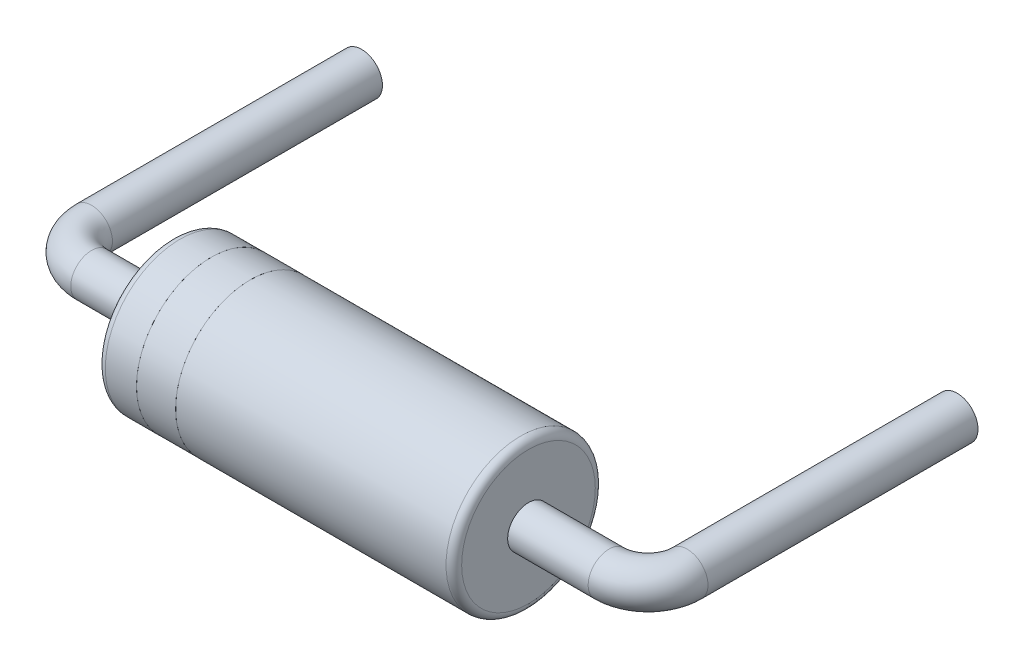
ISO-10303-21;
HEADER;
FILE_DESCRIPTION(('STEP AP214'),'2;1');
FILE_NAME('part.step','',(''),(''),'','','');
FILE_SCHEMA(('AUTOMOTIVE_DESIGN { 1 0 10303 214 1 1 1 1 }'));
ENDSEC;
DATA;
#1=APPLICATION_CONTEXT('core data for automotive mechanical design processes');
#2=APPLICATION_PROTOCOL_DEFINITION('international standard','automotive_design',2000,#1);
#3=PRODUCT_CONTEXT('',#1,'mechanical');
#4=PRODUCT('Part','Part','',(#3));
#5=PRODUCT_RELATED_PRODUCT_CATEGORY('part','',(#4));
#6=PRODUCT_DEFINITION_FORMATION('','',#4);
#7=PRODUCT_DEFINITION_CONTEXT('part definition',#1,'design');
#8=PRODUCT_DEFINITION('design','',#6,#7);
#9=PRODUCT_DEFINITION_SHAPE('','',#8);
#10=(LENGTH_UNIT() NAMED_UNIT(*) SI_UNIT(.MILLI.,.METRE.));
#11=(NAMED_UNIT(*) PLANE_ANGLE_UNIT() SI_UNIT($,.RADIAN.));
#12=(NAMED_UNIT(*) SI_UNIT($,.STERADIAN.) SOLID_ANGLE_UNIT());
#13=UNCERTAINTY_MEASURE_WITH_UNIT(LENGTH_MEASURE(1.E-05),#10,'distance_accuracy_value','');
#14=(GEOMETRIC_REPRESENTATION_CONTEXT(3) GLOBAL_UNCERTAINTY_ASSIGNED_CONTEXT((#13)) GLOBAL_UNIT_ASSIGNED_CONTEXT((#10,
#11,#12)) REPRESENTATION_CONTEXT('',''));
#15=CARTESIAN_POINT('',(0.,0.,0.));
#16=DIRECTION('',(0.,0.,1.));
#17=DIRECTION('',(1.,0.,0.));
#18=AXIS2_PLACEMENT_3D('',#15,#16,#17);
#19=CARTESIAN_POINT('',(-2.28,-0.29315,1.24815));
#20=DIRECTION('',(1.,0.,0.));
#21=DIRECTION('',(0.,0.,-1.));
#22=AXIS2_PLACEMENT_3D('',#19,#20,#21);
#23=PLANE('',#22);
#24=CARTESIAN_POINT('',(-2.28,0.,0.955));
#25=DIRECTION('',(1.,0.,0.));
#26=DIRECTION('',(0.,0.,-1.));
#27=AXIS2_PLACEMENT_3D('',#24,#25,#26);
#28=CIRCLE('',#27,0.2665);
#29=CARTESIAN_POINT('',(-2.28,0.,0.6885));
#30=VERTEX_POINT('',#29);
#31=EDGE_CURVE('P0_E25',#30,#30,#28,.F.);
#32=ORIENTED_EDGE('',*,*,#31,.F.);
#33=EDGE_LOOP('',(#32));
#34=FACE_BOUND('',#33,.T.);
#35=ADVANCED_FACE('P0_F22',(#34),#23,.T.);
#36=CARTESIAN_POINT('',(-3.3615,0.,0.955));
#37=DIRECTION('',(1.,0.,0.));
#38=DIRECTION('',(0.,0.,-1.));
#39=AXIS2_PLACEMENT_3D('',#36,#37,#38);
#40=CYLINDRICAL_SURFACE('',#39,0.2665);
#41=ORIENTED_EDGE('',*,*,#31,.T.);
#42=EDGE_LOOP('',(#41));
#43=FACE_BOUND('',#42,.T.);
#44=CARTESIAN_POINT('',(-3.31,0.,0.955));
#45=DIRECTION('',(1.,0.,0.));
#46=DIRECTION('',(0.,0.,1.));
#47=AXIS2_PLACEMENT_3D('',#44,#45,#46);
#48=CIRCLE('',#47,0.2665);
#49=CARTESIAN_POINT('',(-3.31,0.,1.2215));
#50=VERTEX_POINT('',#49);
#51=EDGE_CURVE('P0_E33',#50,#50,#48,.F.);
#52=ORIENTED_EDGE('',*,*,#51,.F.);
#53=EDGE_LOOP('',(#52));
#54=FACE_BOUND('',#53,.T.);
#55=ADVANCED_FACE('P0_F44',(#43,#54),#40,.T.);
#56=CARTESIAN_POINT('',(-3.31,0.,0.455));
#57=DIRECTION('',(0.,1.,0.));
#58=DIRECTION('',(0.,0.,1.));
#59=AXIS2_PLACEMENT_3D('',#56,#57,#58);
#60=TOROIDAL_SURFACE('',#59,0.5,0.2665);
#61=CARTESIAN_POINT('',(-3.81,0.,0.455));
#62=DIRECTION('',(0.,0.,1.));
#63=DIRECTION('',(1.,0.,0.));
#64=AXIS2_PLACEMENT_3D('',#61,#62,#63);
#65=CIRCLE('',#64,0.2665);
#66=CARTESIAN_POINT('',(-3.5435,0.,0.455));
#67=VERTEX_POINT('',#66);
#68=EDGE_CURVE('P0_E29',#67,#67,#65,.F.);
#69=ORIENTED_EDGE('',*,*,#68,.F.);
#70=EDGE_LOOP('',(#69));
#71=FACE_BOUND('',#70,.T.);
#72=ORIENTED_EDGE('',*,*,#51,.T.);
#73=EDGE_LOOP('',(#72));
#74=FACE_BOUND('',#73,.T.);
#75=ADVANCED_FACE('P0_F40',(#71,#74),#60,.T.);
#76=CARTESIAN_POINT('',(-4.10315,-0.29315,-3.));
#77=DIRECTION('',(0.,0.,1.));
#78=DIRECTION('',(1.,0.,0.));
#79=AXIS2_PLACEMENT_3D('',#76,#77,#78);
#80=PLANE('',#79);
#81=CARTESIAN_POINT('',(-3.81,0.,-3.));
#82=DIRECTION('',(0.,0.,1.));
#83=DIRECTION('',(1.,0.,0.));
#84=AXIS2_PLACEMENT_3D('',#81,#82,#83);
#85=CIRCLE('',#84,0.2665);
#86=CARTESIAN_POINT('',(-3.5435,0.,-3.));
#87=VERTEX_POINT('',#86);
#88=EDGE_CURVE('P0_E12',#87,#87,#85,.T.);
#89=ORIENTED_EDGE('',*,*,#88,.F.);
#90=EDGE_LOOP('',(#89));
#91=FACE_BOUND('',#90,.T.);
#92=ADVANCED_FACE('P0_F43',(#91),#80,.F.);
#93=CARTESIAN_POINT('',(-3.81,0.,-3.17275));
#94=DIRECTION('',(0.,0.,1.));
#95=DIRECTION('',(1.,0.,0.));
#96=AXIS2_PLACEMENT_3D('',#93,#94,#95);
#97=CYLINDRICAL_SURFACE('',#96,0.2665);
#98=ORIENTED_EDGE('',*,*,#68,.T.);
#99=EDGE_LOOP('',(#98));
#100=FACE_BOUND('',#99,.T.);
#101=ORIENTED_EDGE('',*,*,#88,.T.);
#102=EDGE_LOOP('',(#101));
#103=FACE_BOUND('',#102,.T.);
#104=ADVANCED_FACE('P0_F56',(#100,#103),#97,.T.);
#105=CLOSED_SHELL('',(#35,#55,#75,#92,#104));
#106=MANIFOLD_SOLID_BREP('P0_B1',#105);
#107=CARTESIAN_POINT('',(2.28,-0.29315,0.66185));
#108=DIRECTION('',(-1.,0.,0.));
#109=DIRECTION('',(0.,0.,1.));
#110=AXIS2_PLACEMENT_3D('',#107,#108,#109);
#111=PLANE('',#110);
#112=CARTESIAN_POINT('',(2.28,0.,0.955));
#113=DIRECTION('',(-1.,0.,0.));
#114=DIRECTION('',(0.,0.,1.));
#115=AXIS2_PLACEMENT_3D('',#112,#113,#114);
#116=CIRCLE('',#115,0.2665);
#117=CARTESIAN_POINT('',(2.28,0.,1.2215));
#118=VERTEX_POINT('',#117);
#119=EDGE_CURVE('P1_E17',#118,#118,#116,.F.);
#120=ORIENTED_EDGE('',*,*,#119,.F.);
#121=EDGE_LOOP('',(#120));
#122=FACE_BOUND('',#121,.T.);
#123=ADVANCED_FACE('P1_F14',(#122),#111,.T.);
#124=CARTESIAN_POINT('',(3.3615,0.,0.955));
#125=DIRECTION('',(-1.,0.,0.));
#126=DIRECTION('',(0.,0.,1.));
#127=AXIS2_PLACEMENT_3D('',#124,#125,#126);
#128=CYLINDRICAL_SURFACE('',#127,0.2665);
#129=ORIENTED_EDGE('',*,*,#119,.T.);
#130=EDGE_LOOP('',(#129));
#131=FACE_BOUND('',#130,.T.);
#132=CARTESIAN_POINT('',(3.31,0.,0.955));
#133=DIRECTION('',(-1.,0.,0.));
#134=DIRECTION('',(0.,0.,1.));
#135=AXIS2_PLACEMENT_3D('',#132,#133,#134);
#136=CIRCLE('',#135,0.2665);
#137=CARTESIAN_POINT('',(3.31,0.,1.2215));
#138=VERTEX_POINT('',#137);
#139=EDGE_CURVE('P1_E25',#138,#138,#136,.F.);
#140=ORIENTED_EDGE('',*,*,#139,.F.);
#141=EDGE_LOOP('',(#140));
#142=FACE_BOUND('',#141,.T.);
#143=ADVANCED_FACE('P1_F36',(#131,#142),#128,.T.);
#144=CARTESIAN_POINT('',(3.31,0.,0.455));
#145=DIRECTION('',(0.,-1.,0.));
#146=DIRECTION('',(0.,0.,-1.));
#147=AXIS2_PLACEMENT_3D('',#144,#145,#146);
#148=TOROIDAL_SURFACE('',#147,0.5,0.2665);
#149=ORIENTED_EDGE('',*,*,#139,.T.);
#150=EDGE_LOOP('',(#149));
#151=FACE_BOUND('',#150,.T.);
#152=CARTESIAN_POINT('',(3.81,0.,0.455));
#153=DIRECTION('',(0.,0.,1.));
#154=DIRECTION('',(1.,0.,0.));
#155=AXIS2_PLACEMENT_3D('',#152,#153,#154);
#156=CIRCLE('',#155,0.2665);
#157=CARTESIAN_POINT('',(4.0765,0.,0.455));
#158=VERTEX_POINT('',#157);
#159=EDGE_CURVE('P1_E21',#158,#158,#156,.F.);
#160=ORIENTED_EDGE('',*,*,#159,.F.);
#161=EDGE_LOOP('',(#160));
#162=FACE_BOUND('',#161,.T.);
#163=ADVANCED_FACE('P1_F32',(#151,#162),#148,.T.);
#164=CARTESIAN_POINT('',(3.51685,-0.29315,-3.));
#165=DIRECTION('',(0.,0.,1.));
#166=DIRECTION('',(1.,0.,0.));
#167=AXIS2_PLACEMENT_3D('',#164,#165,#166);
#168=PLANE('',#167);
#169=CARTESIAN_POINT('',(3.81,0.,-3.));
#170=DIRECTION('',(0.,0.,1.));
#171=DIRECTION('',(1.,0.,0.));
#172=AXIS2_PLACEMENT_3D('',#169,#170,#171);
#173=CIRCLE('',#172,0.2665);
#174=CARTESIAN_POINT('',(4.0765,0.,-3.));
#175=VERTEX_POINT('',#174);
#176=EDGE_CURVE('P1_E10',#175,#175,#173,.T.);
#177=ORIENTED_EDGE('',*,*,#176,.F.);
#178=EDGE_LOOP('',(#177));
#179=FACE_BOUND('',#178,.T.);
#180=ADVANCED_FACE('P1_F35',(#179),#168,.F.);
#181=CARTESIAN_POINT('',(3.81,0.,-3.17275));
#182=DIRECTION('',(0.,0.,1.));
#183=DIRECTION('',(1.,0.,0.));
#184=AXIS2_PLACEMENT_3D('',#181,#182,#183);
#185=CYLINDRICAL_SURFACE('',#184,0.2665);
#186=ORIENTED_EDGE('',*,*,#159,.T.);
#187=EDGE_LOOP('',(#186));
#188=FACE_BOUND('',#187,.T.);
#189=ORIENTED_EDGE('',*,*,#176,.T.);
#190=EDGE_LOOP('',(#189));
#191=FACE_BOUND('',#190,.T.);
#192=ADVANCED_FACE('P1_F48',(#188,#191),#185,.T.);
#193=CLOSED_SHELL('',(#123,#143,#163,#180,#192));
#194=MANIFOLD_SOLID_BREP('P1_B1',#193);
#195=CARTESIAN_POINT('',(-2.28,0.9405,0.0145));
#196=DIRECTION('',(-1.,0.,0.));
#197=DIRECTION('',(0.,0.,1.));
#198=AXIS2_PLACEMENT_3D('',#195,#196,#197);
#199=PLANE('',#198);
#200=CARTESIAN_POINT('',(-2.28,0.,0.955));
#201=DIRECTION('',(1.,0.,0.));
#202=DIRECTION('',(0.,0.,-1.));
#203=AXIS2_PLACEMENT_3D('',#200,#201,#202);
#204=CIRCLE('',#203,0.855);
#205=CARTESIAN_POINT('',(-2.28,0.,0.1));
#206=VERTEX_POINT('',#205);
#207=CARTESIAN_POINT('',(-2.28,0.855,0.955));
#208=VERTEX_POINT('',#207);
#209=EDGE_CURVE('P2_E41',#206,#208,#204,.T.);
#210=ORIENTED_EDGE('',*,*,#209,.F.);
#211=CARTESIAN_POINT('',(-2.28,0.,0.955));
#212=DIRECTION('',(1.,0.,0.));
#213=DIRECTION('',(0.,0.,1.));
#214=AXIS2_PLACEMENT_3D('',#211,#212,#213);
#215=CIRCLE('',#214,0.855);
#216=CARTESIAN_POINT('',(-2.28,0.,1.81));
#217=VERTEX_POINT('',#216);
#218=EDGE_CURVE('P2_E34',#217,#206,#215,.T.);
#219=ORIENTED_EDGE('',*,*,#218,.F.);
#220=CARTESIAN_POINT('',(-2.28,0.,0.955));
#221=DIRECTION('',(1.,0.,0.));
#222=DIRECTION('',(0.,1.,0.));
#223=AXIS2_PLACEMENT_3D('',#220,#221,#222);
#224=CIRCLE('',#223,0.855);
#225=EDGE_CURVE('P2_E40',#208,#217,#224,.T.);
#226=ORIENTED_EDGE('',*,*,#225,.F.);
#227=EDGE_LOOP('',(#210,#219,#226));
#228=FACE_BOUND('',#227,.T.);
#229=ADVANCED_FACE('P2_F16',(#228),#199,.T.);
#230=CARTESIAN_POINT('',(-2.18,0.,0.955));
#231=DIRECTION('',(-1.,0.,0.));
#232=DIRECTION('',(0.,0.,1.));
#233=AXIS2_PLACEMENT_3D('',#230,#231,#232);
#234=TOROIDAL_SURFACE('',#233,0.855,0.1);
#235=ORIENTED_EDGE('',*,*,#225,.T.);
#236=ORIENTED_EDGE('',*,*,#218,.T.);
#237=ORIENTED_EDGE('',*,*,#209,.T.);
#238=EDGE_LOOP('',(#235,#236,#237));
#239=FACE_BOUND('',#238,.T.);
#240=CARTESIAN_POINT('',(-2.18,0.,0.955));
#241=DIRECTION('',(1.,0.,0.));
#242=DIRECTION('',(0.,0.,-1.));
#243=AXIS2_PLACEMENT_3D('',#240,#241,#242);
#244=CIRCLE('',#243,0.955);
#245=CARTESIAN_POINT('',(-2.18,0.,0.));
#246=VERTEX_POINT('',#245);
#247=EDGE_CURVE('P2_E26',#246,#246,#244,.T.);
#248=ORIENTED_EDGE('',*,*,#247,.F.);
#249=EDGE_LOOP('',(#248));
#250=FACE_BOUND('',#249,.T.);
#251=ADVANCED_FACE('P2_F43',(#239,#250),#234,.T.);
#252=CARTESIAN_POINT('',(-2.2,0.,0.955));
#253=DIRECTION('',(1.,0.,0.));
#254=DIRECTION('',(0.,0.,-1.));
#255=AXIS2_PLACEMENT_3D('',#252,#253,#254);
#256=CYLINDRICAL_SURFACE('',#255,0.955);
#257=ORIENTED_EDGE('',*,*,#247,.T.);
#258=EDGE_LOOP('',(#257));
#259=FACE_BOUND('',#258,.T.);
#260=CARTESIAN_POINT('',(-1.78,0.,0.955));
#261=DIRECTION('',(1.,0.,0.));
#262=DIRECTION('',(0.,0.,-1.));
#263=AXIS2_PLACEMENT_3D('',#260,#261,#262);
#264=CIRCLE('',#263,0.955);
#265=CARTESIAN_POINT('',(-1.78,0.,0.));
#266=VERTEX_POINT('',#265);
#267=EDGE_CURVE('P2_E11',#266,#266,#264,.F.);
#268=ORIENTED_EDGE('',*,*,#267,.T.);
#269=EDGE_LOOP('',(#268));
#270=FACE_BOUND('',#269,.T.);
#271=ADVANCED_FACE('P2_F88',(#259,#270),#256,.T.);
#272=CARTESIAN_POINT('',(-1.78,1.0505,-0.0955));
#273=DIRECTION('',(-1.,0.,0.));
#274=DIRECTION('',(0.,0.,1.));
#275=AXIS2_PLACEMENT_3D('',#272,#273,#274);
#276=PLANE('',#275);
#277=ORIENTED_EDGE('',*,*,#267,.F.);
#278=EDGE_LOOP('',(#277));
#279=FACE_BOUND('',#278,.T.);
#280=ADVANCED_FACE('P2_F100',(#279),#276,.F.);
#281=CLOSED_SHELL('',(#229,#251,#271,#280));
#282=MANIFOLD_SOLID_BREP('P2_B1',#281);
#283=CARTESIAN_POINT('',(-1.78,1.0505,-0.0955));
#284=DIRECTION('',(-1.,0.,0.));
#285=DIRECTION('',(0.,0.,1.));
#286=AXIS2_PLACEMENT_3D('',#283,#284,#285);
#287=PLANE('',#286);
#288=CARTESIAN_POINT('',(-1.78,0.,0.955));
#289=DIRECTION('',(-1.,0.,0.));
#290=DIRECTION('',(0.,0.,1.));
#291=AXIS2_PLACEMENT_3D('',#288,#289,#290);
#292=CIRCLE('',#291,0.955);
#293=CARTESIAN_POINT('',(-1.78,0.,1.91));
#294=VERTEX_POINT('',#293);
#295=EDGE_CURVE('P3_E17',#294,#294,#292,.F.);
#296=ORIENTED_EDGE('',*,*,#295,.F.);
#297=EDGE_LOOP('',(#296));
#298=FACE_BOUND('',#297,.T.);
#299=ADVANCED_FACE('P3_F14',(#298),#287,.T.);
#300=CARTESIAN_POINT('',(-1.255,0.,0.955));
#301=DIRECTION('',(-1.,0.,0.));
#302=DIRECTION('',(0.,0.,1.));
#303=AXIS2_PLACEMENT_3D('',#300,#301,#302);
#304=CYLINDRICAL_SURFACE('',#303,0.955);
#305=CARTESIAN_POINT('',(-1.28,0.,0.955));
#306=DIRECTION('',(-1.,0.,0.));
#307=DIRECTION('',(0.,0.,1.));
#308=AXIS2_PLACEMENT_3D('',#305,#306,#307);
#309=CIRCLE('',#308,0.955);
#310=CARTESIAN_POINT('',(-1.28,0.,1.91));
#311=VERTEX_POINT('',#310);
#312=EDGE_CURVE('P3_E10',#311,#311,#309,.F.);
#313=ORIENTED_EDGE('',*,*,#312,.F.);
#314=EDGE_LOOP('',(#313));
#315=FACE_BOUND('',#314,.T.);
#316=ORIENTED_EDGE('',*,*,#295,.T.);
#317=EDGE_LOOP('',(#316));
#318=FACE_BOUND('',#317,.T.);
#319=ADVANCED_FACE('P3_F26',(#315,#318),#304,.T.);
#320=CARTESIAN_POINT('',(-1.28,-1.0505,-0.0955));
#321=DIRECTION('',(1.,0.,0.));
#322=DIRECTION('',(0.,0.,-1.));
#323=AXIS2_PLACEMENT_3D('',#320,#321,#322);
#324=PLANE('',#323);
#325=ORIENTED_EDGE('',*,*,#312,.T.);
#326=EDGE_LOOP('',(#325));
#327=FACE_BOUND('',#326,.T.);
#328=ADVANCED_FACE('P3_F33',(#327),#324,.T.);
#329=CLOSED_SHELL('',(#299,#319,#328));
#330=MANIFOLD_SOLID_BREP('P3_B1',#329);
#331=CARTESIAN_POINT('',(2.28,-0.9405,0.0145));
#332=DIRECTION('',(1.,0.,0.));
#333=DIRECTION('',(0.,0.,-1.));
#334=AXIS2_PLACEMENT_3D('',#331,#332,#333);
#335=PLANE('',#334);
#336=CARTESIAN_POINT('',(2.28,0.,0.955));
#337=DIRECTION('',(-1.,0.,0.));
#338=DIRECTION('',(0.,0.,1.));
#339=AXIS2_PLACEMENT_3D('',#336,#337,#338);
#340=CIRCLE('',#339,0.855);
#341=CARTESIAN_POINT('',(2.28,0.855,0.955));
#342=VERTEX_POINT('',#341);
#343=CARTESIAN_POINT('',(2.28,0.,1.81));
#344=VERTEX_POINT('',#343);
#345=EDGE_CURVE('P4_E43',#342,#344,#340,.F.);
#346=ORIENTED_EDGE('',*,*,#345,.T.);
#347=CARTESIAN_POINT('',(2.28,0.,0.955));
#348=DIRECTION('',(-1.,0.,0.));
#349=DIRECTION('',(0.,0.,-1.));
#350=AXIS2_PLACEMENT_3D('',#347,#348,#349);
#351=CIRCLE('',#350,0.855);
#352=CARTESIAN_POINT('',(2.28,0.,0.0999999999999999));
#353=VERTEX_POINT('',#352);
#354=EDGE_CURVE('P4_E53',#353,#344,#351,.T.);
#355=ORIENTED_EDGE('',*,*,#354,.F.);
#356=CARTESIAN_POINT('',(2.28,0.,0.955));
#357=DIRECTION('',(-1.,0.,0.));
#358=DIRECTION('',(0.,1.,0.));
#359=AXIS2_PLACEMENT_3D('',#356,#357,#358);
#360=CIRCLE('',#359,0.855000000000001);
#361=EDGE_CURVE('P4_E51',#353,#342,#360,.F.);
#362=ORIENTED_EDGE('',*,*,#361,.T.);
#363=EDGE_LOOP('',(#346,#355,#362));
#364=FACE_BOUND('',#363,.T.);
#365=ADVANCED_FACE('P4_F24',(#364),#335,.T.);
#366=CARTESIAN_POINT('',(2.18,0.,0.955));
#367=DIRECTION('',(1.,0.,0.));
#368=DIRECTION('',(0.,0.,-1.));
#369=AXIS2_PLACEMENT_3D('',#366,#367,#368);
#370=TOROIDAL_SURFACE('',#369,0.855,0.1);
#371=CARTESIAN_POINT('',(2.18,0.,0.955));
#372=DIRECTION('',(1.,0.,0.));
#373=DIRECTION('',(0.,0.,-1.));
#374=AXIS2_PLACEMENT_3D('',#371,#372,#373);
#375=CIRCLE('',#374,0.955);
#376=CARTESIAN_POINT('',(2.18,0.,0.));
#377=VERTEX_POINT('',#376);
#378=EDGE_CURVE('P4_E35',#377,#377,#375,.F.);
#379=ORIENTED_EDGE('',*,*,#378,.F.);
#380=EDGE_LOOP('',(#379));
#381=FACE_BOUND('',#380,.T.);
#382=ORIENTED_EDGE('',*,*,#345,.F.);
#383=ORIENTED_EDGE('',*,*,#361,.F.);
#384=ORIENTED_EDGE('',*,*,#354,.T.);
#385=EDGE_LOOP('',(#382,#383,#384));
#386=FACE_BOUND('',#385,.T.);
#387=ADVANCED_FACE('P4_F50',(#381,#386),#370,.T.);
#388=CARTESIAN_POINT('',(-1.28,-1.0505,-0.0955));
#389=DIRECTION('',(1.,0.,0.));
#390=DIRECTION('',(0.,0.,-1.));
#391=AXIS2_PLACEMENT_3D('',#388,#389,#390);
#392=PLANE('',#391);
#393=CARTESIAN_POINT('',(-1.28,0.,0.955));
#394=DIRECTION('',(1.,0.,0.));
#395=DIRECTION('',(0.,0.,-1.));
#396=AXIS2_PLACEMENT_3D('',#393,#394,#395);
#397=CIRCLE('',#396,0.955);
#398=CARTESIAN_POINT('',(-1.28,0.,0.));
#399=VERTEX_POINT('',#398);
#400=EDGE_CURVE('P4_E13',#399,#399,#397,.T.);
#401=ORIENTED_EDGE('',*,*,#400,.F.);
#402=EDGE_LOOP('',(#401));
#403=FACE_BOUND('',#402,.T.);
#404=ADVANCED_FACE('P4_F88',(#403),#392,.F.);
#405=CARTESIAN_POINT('',(-1.453,0.,0.955));
#406=DIRECTION('',(1.,0.,0.));
#407=DIRECTION('',(0.,0.,-1.));
#408=AXIS2_PLACEMENT_3D('',#405,#406,#407);
#409=CYLINDRICAL_SURFACE('',#408,0.955);
#410=ORIENTED_EDGE('',*,*,#378,.T.);
#411=EDGE_LOOP('',(#410));
#412=FACE_BOUND('',#411,.T.);
#413=ORIENTED_EDGE('',*,*,#400,.T.);
#414=EDGE_LOOP('',(#413));
#415=FACE_BOUND('',#414,.T.);
#416=ADVANCED_FACE('P4_F109',(#412,#415),#409,.T.);
#417=CLOSED_SHELL('',(#365,#387,#404,#416));
#418=MANIFOLD_SOLID_BREP('P4_B1',#417);
#419=ADVANCED_BREP_SHAPE_REPRESENTATION('',(#18,#106,#194,#282,#330,#418),#14);
#420=SHAPE_DEFINITION_REPRESENTATION(#9,#419);
ENDSEC;
END-ISO-10303-21;
